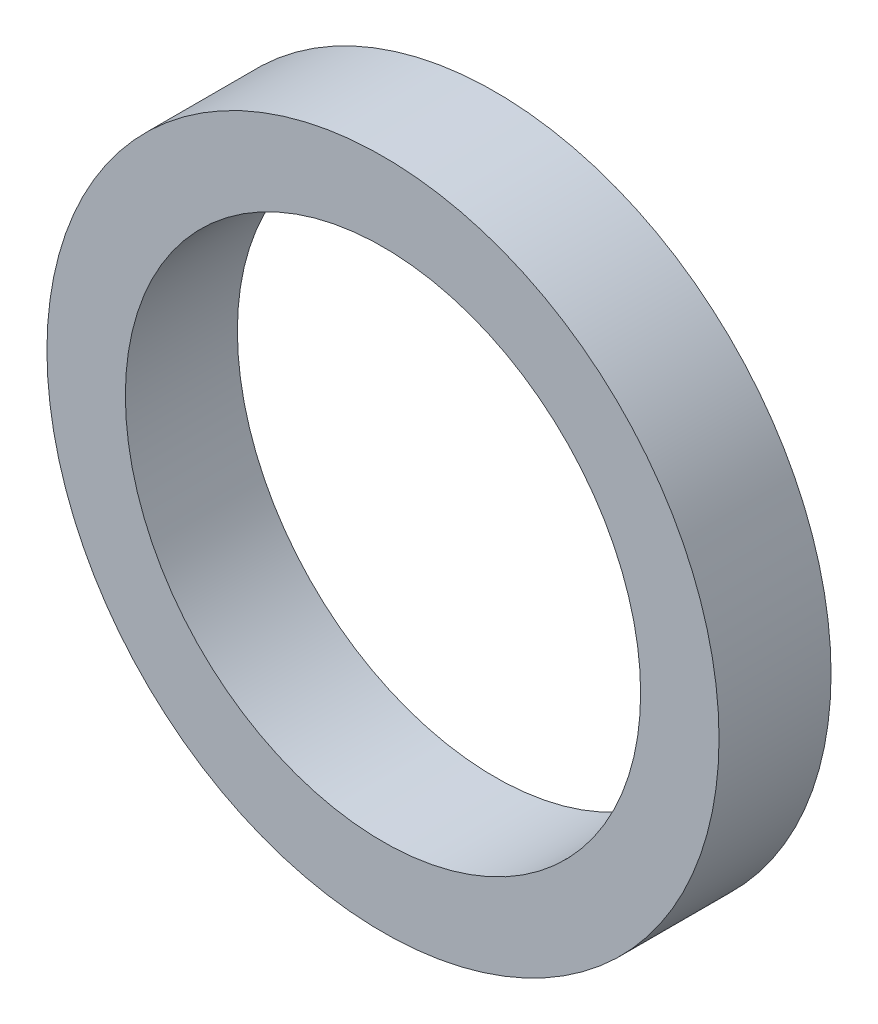
ISO-10303-21;
HEADER;
FILE_DESCRIPTION(('STEP AP214'),'2;1');
FILE_NAME('part.step','',(''),(''),'','','');
FILE_SCHEMA(('AUTOMOTIVE_DESIGN { 1 0 10303 214 1 1 1 1 }'));
ENDSEC;
DATA;
#1=APPLICATION_CONTEXT('core data for automotive mechanical design processes');
#2=APPLICATION_PROTOCOL_DEFINITION('international standard','automotive_design',2000,#1);
#3=PRODUCT_CONTEXT('',#1,'mechanical');
#4=PRODUCT('Part','Part','',(#3));
#5=PRODUCT_RELATED_PRODUCT_CATEGORY('part','',(#4));
#6=PRODUCT_DEFINITION_FORMATION('','',#4);
#7=PRODUCT_DEFINITION_CONTEXT('part definition',#1,'design');
#8=PRODUCT_DEFINITION('design','',#6,#7);
#9=PRODUCT_DEFINITION_SHAPE('','',#8);
#10=(LENGTH_UNIT() NAMED_UNIT(*) SI_UNIT(.MILLI.,.METRE.));
#11=(NAMED_UNIT(*) PLANE_ANGLE_UNIT() SI_UNIT($,.RADIAN.));
#12=(NAMED_UNIT(*) SI_UNIT($,.STERADIAN.) SOLID_ANGLE_UNIT());
#13=UNCERTAINTY_MEASURE_WITH_UNIT(LENGTH_MEASURE(1.E-05),#10,'distance_accuracy_value','');
#14=(GEOMETRIC_REPRESENTATION_CONTEXT(3) GLOBAL_UNCERTAINTY_ASSIGNED_CONTEXT((#13)) GLOBAL_UNIT_ASSIGNED_CONTEXT((#10,
#11,#12)) REPRESENTATION_CONTEXT('',''));
#15=CARTESIAN_POINT('',(0.,0.,0.));
#16=DIRECTION('',(0.,0.,1.));
#17=DIRECTION('',(1.,0.,0.));
#18=AXIS2_PLACEMENT_3D('',#15,#16,#17);
#19=CARTESIAN_POINT('',(0.,0.,5.));
#20=DIRECTION('',(0.,0.,1.));
#21=DIRECTION('',(1.,0.,0.));
#22=AXIS2_PLACEMENT_3D('',#19,#20,#21);
#23=PLANE('',#22);
#24=CARTESIAN_POINT('',(0.,0.,5.));
#25=DIRECTION('',(0.,0.,1.));
#26=DIRECTION('',(1.,0.,0.));
#27=AXIS2_PLACEMENT_3D('',#24,#25,#26);
#28=CIRCLE('',#27,15.);
#29=CARTESIAN_POINT('',(15.,0.,5.));
#30=VERTEX_POINT('',#29);
#31=EDGE_CURVE('E10',#30,#30,#28,.T.);
#32=ORIENTED_EDGE('',*,*,#31,.T.);
#33=EDGE_LOOP('',(#32));
#34=FACE_BOUND('',#33,.T.);
#35=CARTESIAN_POINT('',(0.,0.,5.));
#36=DIRECTION('',(0.,0.,1.));
#37=DIRECTION('',(1.,0.,0.));
#38=AXIS2_PLACEMENT_3D('',#35,#36,#37);
#39=CIRCLE('',#38,11.5);
#40=CARTESIAN_POINT('',(11.5,0.,5.));
#41=VERTEX_POINT('',#40);
#42=EDGE_CURVE('E50',#41,#41,#39,.T.);
#43=ORIENTED_EDGE('',*,*,#42,.F.);
#44=EDGE_LOOP('',(#43));
#45=FACE_BOUND('',#44,.T.);
#46=ADVANCED_FACE('F37',(#34,#45),#23,.T.);
#47=CARTESIAN_POINT('',(0.,0.,0.));
#48=DIRECTION('',(0.,0.,1.));
#49=DIRECTION('',(1.,0.,0.));
#50=AXIS2_PLACEMENT_3D('',#47,#48,#49);
#51=PLANE('',#50);
#52=CARTESIAN_POINT('',(0.,0.,0.));
#53=DIRECTION('',(0.,0.,1.));
#54=DIRECTION('',(1.,0.,0.));
#55=AXIS2_PLACEMENT_3D('',#52,#53,#54);
#56=CIRCLE('',#55,15.);
#57=CARTESIAN_POINT('',(15.,0.,0.));
#58=VERTEX_POINT('',#57);
#59=EDGE_CURVE('E41',#58,#58,#56,.T.);
#60=ORIENTED_EDGE('',*,*,#59,.F.);
#61=EDGE_LOOP('',(#60));
#62=FACE_BOUND('',#61,.T.);
#63=CARTESIAN_POINT('',(0.,0.,0.));
#64=DIRECTION('',(0.,0.,1.));
#65=DIRECTION('',(1.,0.,0.));
#66=AXIS2_PLACEMENT_3D('',#63,#64,#65);
#67=CIRCLE('',#66,11.5);
#68=CARTESIAN_POINT('',(11.5,0.,0.));
#69=VERTEX_POINT('',#68);
#70=EDGE_CURVE('E52',#69,#69,#67,.T.);
#71=ORIENTED_EDGE('',*,*,#70,.T.);
#72=EDGE_LOOP('',(#71));
#73=FACE_BOUND('',#72,.T.);
#74=ADVANCED_FACE('F64',(#62,#73),#51,.F.);
#75=CARTESIAN_POINT('',(0.,0.,5.));
#76=DIRECTION('',(0.,0.,-1.));
#77=DIRECTION('',(-1.,0.,0.));
#78=AXIS2_PLACEMENT_3D('',#75,#76,#77);
#79=CYLINDRICAL_SURFACE('',#78,15.);
#80=ORIENTED_EDGE('',*,*,#31,.F.);
#81=EDGE_LOOP('',(#80));
#82=FACE_BOUND('',#81,.T.);
#83=ORIENTED_EDGE('',*,*,#59,.T.);
#84=EDGE_LOOP('',(#83));
#85=FACE_BOUND('',#84,.T.);
#86=ADVANCED_FACE('F39',(#82,#85),#79,.T.);
#87=CARTESIAN_POINT('',(0.,0.,5.));
#88=DIRECTION('',(0.,0.,-1.));
#89=DIRECTION('',(-1.,0.,0.));
#90=AXIS2_PLACEMENT_3D('',#87,#88,#89);
#91=CYLINDRICAL_SURFACE('',#90,11.5);
#92=ORIENTED_EDGE('',*,*,#42,.T.);
#93=EDGE_LOOP('',(#92));
#94=FACE_BOUND('',#93,.T.);
#95=ORIENTED_EDGE('',*,*,#70,.F.);
#96=EDGE_LOOP('',(#95));
#97=FACE_BOUND('',#96,.T.);
#98=ADVANCED_FACE('F60',(#94,#97),#91,.F.);
#99=CLOSED_SHELL('',(#46,#74,#86,#98));
#100=MANIFOLD_SOLID_BREP('B2',#99);
#101=ADVANCED_BREP_SHAPE_REPRESENTATION('',(#18,#100),#14);
#102=SHAPE_DEFINITION_REPRESENTATION(#9,#101);
ENDSEC;
END-ISO-10303-21;
